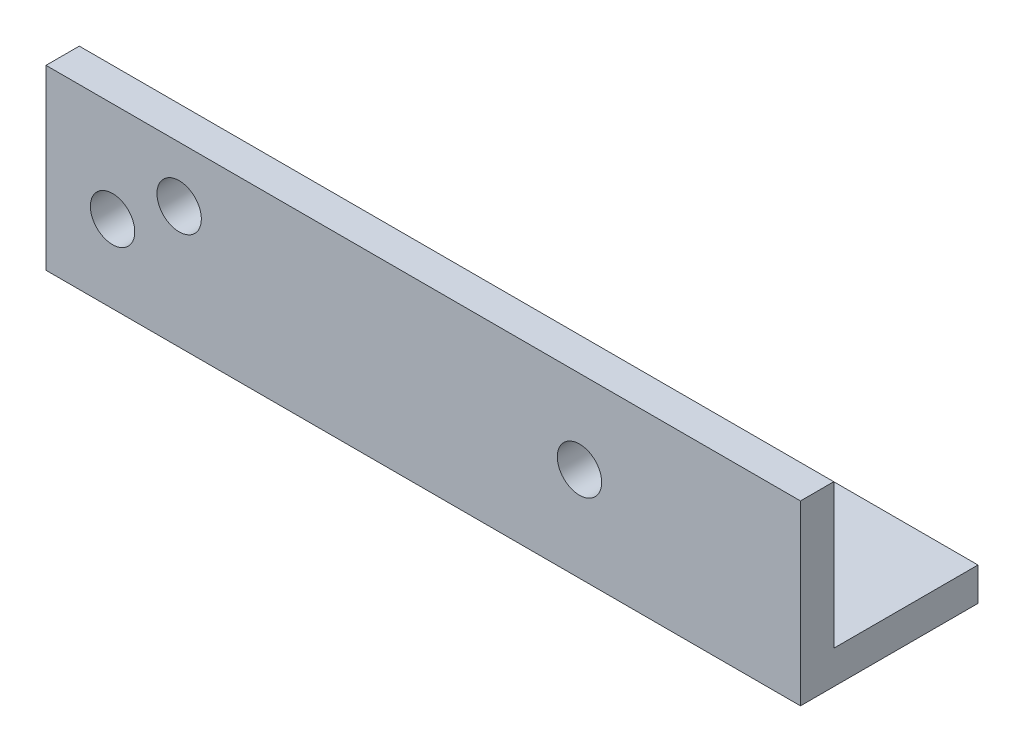
ISO-10303-21;
HEADER;
FILE_DESCRIPTION(('STEP AP214'),'2;1');
FILE_NAME('part.step','',(''),(''),'','','');
FILE_SCHEMA(('AUTOMOTIVE_DESIGN { 1 0 10303 214 1 1 1 1 }'));
ENDSEC;
DATA;
#1=APPLICATION_CONTEXT('core data for automotive mechanical design processes');
#2=APPLICATION_PROTOCOL_DEFINITION('international standard','automotive_design',2000,#1);
#3=PRODUCT_CONTEXT('',#1,'mechanical');
#4=PRODUCT('Part','Part','',(#3));
#5=PRODUCT_RELATED_PRODUCT_CATEGORY('part','',(#4));
#6=PRODUCT_DEFINITION_FORMATION('','',#4);
#7=PRODUCT_DEFINITION_CONTEXT('part definition',#1,'design');
#8=PRODUCT_DEFINITION('design','',#6,#7);
#9=PRODUCT_DEFINITION_SHAPE('','',#8);
#10=(LENGTH_UNIT() NAMED_UNIT(*) SI_UNIT(.MILLI.,.METRE.));
#11=(NAMED_UNIT(*) PLANE_ANGLE_UNIT() SI_UNIT($,.RADIAN.));
#12=(NAMED_UNIT(*) SI_UNIT($,.STERADIAN.) SOLID_ANGLE_UNIT());
#13=UNCERTAINTY_MEASURE_WITH_UNIT(LENGTH_MEASURE(1.E-05),#10,'distance_accuracy_value','');
#14=(GEOMETRIC_REPRESENTATION_CONTEXT(3) GLOBAL_UNCERTAINTY_ASSIGNED_CONTEXT((#13)) GLOBAL_UNIT_ASSIGNED_CONTEXT((#10,
#11,#12)) REPRESENTATION_CONTEXT('',''));
#15=CARTESIAN_POINT('',(0.,0.,0.));
#16=DIRECTION('',(0.,0.,1.));
#17=DIRECTION('',(1.,0.,0.));
#18=AXIS2_PLACEMENT_3D('',#15,#16,#17);
#19=CARTESIAN_POINT('',(107.95,0.,-4.7625));
#20=DIRECTION('',(0.,-1.,0.));
#21=DIRECTION('',(0.,0.,-1.));
#22=AXIS2_PLACEMENT_3D('',#19,#20,#21);
#23=PLANE('',#22);
#24=DIRECTION('',(0.,0.,1.));
#25=VECTOR('',#24,1.);
#26=CARTESIAN_POINT('',(0.,0.,-4.7625));
#27=LINE('',#26,#25);
#28=CARTESIAN_POINT('',(0.,0.,-4.7625));
#29=VERTEX_POINT('',#28);
#30=CARTESIAN_POINT('',(0.,0.,0.));
#31=VERTEX_POINT('',#30);
#32=EDGE_CURVE('E116',#29,#31,#27,.T.);
#33=ORIENTED_EDGE('',*,*,#32,.T.);
#34=DIRECTION('',(-1.,0.,0.));
#35=VECTOR('',#34,1.);
#36=CARTESIAN_POINT('',(107.95,0.,0.));
#37=LINE('',#36,#35);
#38=CARTESIAN_POINT('',(107.95,0.,0.));
#39=VERTEX_POINT('',#38);
#40=EDGE_CURVE('E11',#39,#31,#37,.T.);
#41=ORIENTED_EDGE('',*,*,#40,.F.);
#42=DIRECTION('',(0.,0.,1.));
#43=VECTOR('',#42,1.);
#44=CARTESIAN_POINT('',(107.95,0.,-4.7625));
#45=LINE('',#44,#43);
#46=CARTESIAN_POINT('',(107.95,0.,-4.7625));
#47=VERTEX_POINT('',#46);
#48=EDGE_CURVE('E127',#47,#39,#45,.T.);
#49=ORIENTED_EDGE('',*,*,#48,.F.);
#50=DIRECTION('',(-1.,0.,0.));
#51=VECTOR('',#50,1.);
#52=CARTESIAN_POINT('',(107.95,0.,-4.7625));
#53=LINE('',#52,#51);
#54=EDGE_CURVE('E112',#47,#29,#53,.T.);
#55=ORIENTED_EDGE('',*,*,#54,.T.);
#56=EDGE_LOOP('',(#33,#41,#49,#55));
#57=FACE_BOUND('',#56,.T.);
#58=ADVANCED_FACE('F32',(#57),#23,.F.);
#59=CARTESIAN_POINT('',(107.95,0.,0.));
#60=DIRECTION('',(0.,0.,-1.));
#61=DIRECTION('',(0.,1.,0.));
#62=AXIS2_PLACEMENT_3D('',#59,#60,#61);
#63=PLANE('',#62);
#64=CARTESIAN_POINT('',(76.3321770290875,-11.9296158183965,0.));
#65=DIRECTION('',(0.,0.,1.));
#66=DIRECTION('',(1.,0.,0.));
#67=AXIS2_PLACEMENT_3D('',#64,#65,#66);
#68=CIRCLE('',#67,3.17500000000842);
#69=CARTESIAN_POINT('',(79.5071770290959,-11.9296158183965,0.));
#70=VERTEX_POINT('',#69);
#71=EDGE_CURVE('E285',#70,#70,#68,.T.);
#72=ORIENTED_EDGE('',*,*,#71,.F.);
#73=EDGE_LOOP('',(#72));
#74=FACE_BOUND('',#73,.T.);
#75=CARTESIAN_POINT('',(19.05,-7.9375,0.));
#76=DIRECTION('',(0.,0.,-1.));
#77=DIRECTION('',(0.,1.,0.));
#78=AXIS2_PLACEMENT_3D('',#75,#76,#77);
#79=CIRCLE('',#78,3.175);
#80=CARTESIAN_POINT('',(19.05,-4.7625,0.));
#81=VERTEX_POINT('',#80);
#82=EDGE_CURVE('E272',#81,#81,#79,.F.);
#83=ORIENTED_EDGE('',*,*,#82,.F.);
#84=EDGE_LOOP('',(#83));
#85=FACE_BOUND('',#84,.T.);
#86=CARTESIAN_POINT('',(9.525,-14.2875,0.));
#87=DIRECTION('',(0.,0.,-1.));
#88=DIRECTION('',(0.,1.,0.));
#89=AXIS2_PLACEMENT_3D('',#86,#87,#88);
#90=CIRCLE('',#89,3.175);
#91=CARTESIAN_POINT('',(9.525,-11.1125,0.));
#92=VERTEX_POINT('',#91);
#93=EDGE_CURVE('E120',#92,#92,#90,.F.);
#94=ORIENTED_EDGE('',*,*,#93,.F.);
#95=EDGE_LOOP('',(#94));
#96=FACE_BOUND('',#95,.T.);
#97=DIRECTION('',(0.,-1.,0.));
#98=VECTOR('',#97,1.);
#99=CARTESIAN_POINT('',(0.,0.,0.));
#100=LINE('',#99,#98);
#101=CARTESIAN_POINT('',(0.,-25.4,0.));
#102=VERTEX_POINT('',#101);
#103=EDGE_CURVE('E119',#31,#102,#100,.T.);
#104=ORIENTED_EDGE('',*,*,#103,.T.);
#105=DIRECTION('',(-1.,0.,0.));
#106=VECTOR('',#105,1.);
#107=CARTESIAN_POINT('',(107.95,-25.4,0.));
#108=LINE('',#107,#106);
#109=CARTESIAN_POINT('',(107.95,-25.4,0.));
#110=VERTEX_POINT('',#109);
#111=EDGE_CURVE('E40',#110,#102,#108,.T.);
#112=ORIENTED_EDGE('',*,*,#111,.F.);
#113=DIRECTION('',(0.,-1.,0.));
#114=VECTOR('',#113,1.);
#115=CARTESIAN_POINT('',(107.95,0.,0.));
#116=LINE('',#115,#114);
#117=EDGE_CURVE('E85',#39,#110,#116,.T.);
#118=ORIENTED_EDGE('',*,*,#117,.F.);
#119=ORIENTED_EDGE('',*,*,#40,.T.);
#120=EDGE_LOOP('',(#104,#112,#118,#119));
#121=FACE_BOUND('',#120,.T.);
#122=ADVANCED_FACE('F155',(#74,#85,#96,#121),#63,.F.);
#123=CARTESIAN_POINT('',(107.95,-25.4,0.));
#124=DIRECTION('',(0.,1.,0.));
#125=DIRECTION('',(0.,0.,1.));
#126=AXIS2_PLACEMENT_3D('',#123,#124,#125);
#127=PLANE('',#126);
#128=CARTESIAN_POINT('',(95.2499999999927,-25.4,-12.7000000000052));
#129=DIRECTION('',(0.,-1.,0.));
#130=DIRECTION('',(0.,0.,-1.));
#131=AXIS2_PLACEMENT_3D('',#128,#129,#130);
#132=CIRCLE('',#131,3.17500000000001);
#133=CARTESIAN_POINT('',(95.2499999999927,-25.4,-15.8750000000052));
#134=VERTEX_POINT('',#133);
#135=EDGE_CURVE('E297',#134,#134,#132,.T.);
#136=ORIENTED_EDGE('',*,*,#135,.F.);
#137=EDGE_LOOP('',(#136));
#138=FACE_BOUND('',#137,.T.);
#139=CARTESIAN_POINT('',(69.8499999999927,-25.4,-12.7000000000052));
#140=DIRECTION('',(0.,-1.,0.));
#141=DIRECTION('',(0.,0.,-1.));
#142=AXIS2_PLACEMENT_3D('',#139,#140,#141);
#143=CIRCLE('',#142,3.175);
#144=CARTESIAN_POINT('',(69.8499999999927,-25.4,-15.8750000000052));
#145=VERTEX_POINT('',#144);
#146=EDGE_CURVE('E291',#145,#145,#143,.T.);
#147=ORIENTED_EDGE('',*,*,#146,.F.);
#148=EDGE_LOOP('',(#147));
#149=FACE_BOUND('',#148,.T.);
#150=DIRECTION('',(0.,0.,-1.));
#151=VECTOR('',#150,1.);
#152=CARTESIAN_POINT('',(0.,-25.4,0.));
#153=LINE('',#152,#151);
#154=CARTESIAN_POINT('',(0.,-25.4,-25.4));
#155=VERTEX_POINT('',#154);
#156=EDGE_CURVE('E122',#102,#155,#153,.T.);
#157=ORIENTED_EDGE('',*,*,#156,.T.);
#158=DIRECTION('',(-1.,0.,0.));
#159=VECTOR('',#158,1.);
#160=CARTESIAN_POINT('',(107.95,-25.4,-25.4));
#161=LINE('',#160,#159);
#162=CARTESIAN_POINT('',(107.95,-25.4,-25.4));
#163=VERTEX_POINT('',#162);
#164=EDGE_CURVE('E107',#163,#155,#161,.T.);
#165=ORIENTED_EDGE('',*,*,#164,.F.);
#166=DIRECTION('',(0.,0.,-1.));
#167=VECTOR('',#166,1.);
#168=CARTESIAN_POINT('',(107.95,-25.4,0.));
#169=LINE('',#168,#167);
#170=EDGE_CURVE('E98',#110,#163,#169,.T.);
#171=ORIENTED_EDGE('',*,*,#170,.F.);
#172=ORIENTED_EDGE('',*,*,#111,.T.);
#173=EDGE_LOOP('',(#157,#165,#171,#172));
#174=FACE_BOUND('',#173,.T.);
#175=ADVANCED_FACE('F133',(#138,#149,#174),#127,.F.);
#176=CARTESIAN_POINT('',(107.95,-25.4,-25.4));
#177=DIRECTION('',(0.,0.,1.));
#178=DIRECTION('',(1.,0.,0.));
#179=AXIS2_PLACEMENT_3D('',#176,#177,#178);
#180=PLANE('',#179);
#181=DIRECTION('',(0.,1.,0.));
#182=VECTOR('',#181,1.);
#183=CARTESIAN_POINT('',(0.,-25.4,-25.4));
#184=LINE('',#183,#182);
#185=CARTESIAN_POINT('',(0.,-20.6375,-25.4));
#186=VERTEX_POINT('',#185);
#187=EDGE_CURVE('E106',#155,#186,#184,.T.);
#188=ORIENTED_EDGE('',*,*,#187,.T.);
#189=DIRECTION('',(-1.,0.,0.));
#190=VECTOR('',#189,1.);
#191=CARTESIAN_POINT('',(107.95,-20.6375,-25.4));
#192=LINE('',#191,#190);
#193=CARTESIAN_POINT('',(107.95,-20.6375,-25.4));
#194=VERTEX_POINT('',#193);
#195=EDGE_CURVE('E103',#194,#186,#192,.T.);
#196=ORIENTED_EDGE('',*,*,#195,.F.);
#197=DIRECTION('',(0.,1.,0.));
#198=VECTOR('',#197,1.);
#199=CARTESIAN_POINT('',(107.95,-25.4,-25.4));
#200=LINE('',#199,#198);
#201=EDGE_CURVE('E92',#163,#194,#200,.T.);
#202=ORIENTED_EDGE('',*,*,#201,.F.);
#203=ORIENTED_EDGE('',*,*,#164,.T.);
#204=EDGE_LOOP('',(#188,#196,#202,#203));
#205=FACE_BOUND('',#204,.T.);
#206=ADVANCED_FACE('F104',(#205),#180,.F.);
#207=CARTESIAN_POINT('',(107.95,-20.6375,-25.4));
#208=DIRECTION('',(0.,-1.,0.));
#209=DIRECTION('',(0.,0.,-1.));
#210=AXIS2_PLACEMENT_3D('',#207,#208,#209);
#211=PLANE('',#210);
#212=CARTESIAN_POINT('',(95.2499999999927,-20.6375,-12.7000000000052));
#213=DIRECTION('',(0.,-1.,0.));
#214=DIRECTION('',(0.,0.,-1.));
#215=AXIS2_PLACEMENT_3D('',#212,#213,#214);
#216=CIRCLE('',#215,3.17500000000001);
#217=CARTESIAN_POINT('',(95.2499999999927,-20.6375,-15.8750000000052));
#218=VERTEX_POINT('',#217);
#219=EDGE_CURVE('E294',#218,#218,#216,.F.);
#220=ORIENTED_EDGE('',*,*,#219,.F.);
#221=EDGE_LOOP('',(#220));
#222=FACE_BOUND('',#221,.T.);
#223=CARTESIAN_POINT('',(69.8499999999927,-20.6375,-12.7000000000052));
#224=DIRECTION('',(0.,-1.,0.));
#225=DIRECTION('',(0.,0.,-1.));
#226=AXIS2_PLACEMENT_3D('',#223,#224,#225);
#227=CIRCLE('',#226,3.175);
#228=CARTESIAN_POINT('',(69.8499999999927,-20.6375,-15.8750000000052));
#229=VERTEX_POINT('',#228);
#230=EDGE_CURVE('E288',#229,#229,#227,.F.);
#231=ORIENTED_EDGE('',*,*,#230,.F.);
#232=EDGE_LOOP('',(#231));
#233=FACE_BOUND('',#232,.T.);
#234=DIRECTION('',(0.,0.,1.));
#235=VECTOR('',#234,1.);
#236=CARTESIAN_POINT('',(0.,-20.6375,-25.4));
#237=LINE('',#236,#235);
#238=CARTESIAN_POINT('',(0.,-20.6375,-4.7625));
#239=VERTEX_POINT('',#238);
#240=EDGE_CURVE('E71',#186,#239,#237,.T.);
#241=ORIENTED_EDGE('',*,*,#240,.T.);
#242=DIRECTION('',(-1.,0.,0.));
#243=VECTOR('',#242,1.);
#244=CARTESIAN_POINT('',(107.95,-20.6375,-4.7625));
#245=LINE('',#244,#243);
#246=CARTESIAN_POINT('',(107.95,-20.6375,-4.7625));
#247=VERTEX_POINT('',#246);
#248=EDGE_CURVE('E108',#247,#239,#245,.T.);
#249=ORIENTED_EDGE('',*,*,#248,.F.);
#250=DIRECTION('',(0.,0.,1.));
#251=VECTOR('',#250,1.);
#252=CARTESIAN_POINT('',(107.95,-20.6375,-25.4));
#253=LINE('',#252,#251);
#254=EDGE_CURVE('E96',#194,#247,#253,.T.);
#255=ORIENTED_EDGE('',*,*,#254,.F.);
#256=ORIENTED_EDGE('',*,*,#195,.T.);
#257=EDGE_LOOP('',(#241,#249,#255,#256));
#258=FACE_BOUND('',#257,.T.);
#259=ADVANCED_FACE('F110',(#222,#233,#258),#211,.F.);
#260=CARTESIAN_POINT('',(107.95,-20.6375,-4.7625));
#261=DIRECTION('',(0.,0.,1.));
#262=DIRECTION('',(0.,-1.,0.));
#263=AXIS2_PLACEMENT_3D('',#260,#261,#262);
#264=PLANE('',#263);
#265=CARTESIAN_POINT('',(76.3321770290875,-11.9296158183965,-4.7625));
#266=DIRECTION('',(0.,0.,1.));
#267=DIRECTION('',(0.,-1.,0.));
#268=AXIS2_PLACEMENT_3D('',#265,#266,#267);
#269=CIRCLE('',#268,3.17500000000842);
#270=CARTESIAN_POINT('',(76.3321770290875,-15.1046158184049,-4.7625));
#271=VERTEX_POINT('',#270);
#272=EDGE_CURVE('E282',#271,#271,#269,.F.);
#273=ORIENTED_EDGE('',*,*,#272,.F.);
#274=EDGE_LOOP('',(#273));
#275=FACE_BOUND('',#274,.T.);
#276=CARTESIAN_POINT('',(19.05,-7.9375,-4.7625));
#277=DIRECTION('',(0.,0.,-1.));
#278=DIRECTION('',(0.,1.,0.));
#279=AXIS2_PLACEMENT_3D('',#276,#277,#278);
#280=CIRCLE('',#279,3.175);
#281=CARTESIAN_POINT('',(19.05,-4.7625,-4.7625));
#282=VERTEX_POINT('',#281);
#283=EDGE_CURVE('E279',#282,#282,#280,.T.);
#284=ORIENTED_EDGE('',*,*,#283,.F.);
#285=EDGE_LOOP('',(#284));
#286=FACE_BOUND('',#285,.T.);
#287=CARTESIAN_POINT('',(9.525,-14.2875,-4.7625));
#288=DIRECTION('',(0.,0.,-1.));
#289=DIRECTION('',(0.,1.,0.));
#290=AXIS2_PLACEMENT_3D('',#287,#288,#289);
#291=CIRCLE('',#290,3.175);
#292=CARTESIAN_POINT('',(9.525,-11.1125,-4.7625));
#293=VERTEX_POINT('',#292);
#294=EDGE_CURVE('E267',#293,#293,#291,.T.);
#295=ORIENTED_EDGE('',*,*,#294,.F.);
#296=EDGE_LOOP('',(#295));
#297=FACE_BOUND('',#296,.T.);
#298=DIRECTION('',(0.,1.,0.));
#299=VECTOR('',#298,1.);
#300=CARTESIAN_POINT('',(0.,-20.6375,-4.7625));
#301=LINE('',#300,#299);
#302=EDGE_CURVE('E77',#239,#29,#301,.T.);
#303=ORIENTED_EDGE('',*,*,#302,.T.);
#304=ORIENTED_EDGE('',*,*,#54,.F.);
#305=DIRECTION('',(0.,1.,0.));
#306=VECTOR('',#305,1.);
#307=CARTESIAN_POINT('',(107.95,-20.6375,-4.7625));
#308=LINE('',#307,#306);
#309=EDGE_CURVE('E48',#247,#47,#308,.T.);
#310=ORIENTED_EDGE('',*,*,#309,.F.);
#311=ORIENTED_EDGE('',*,*,#248,.T.);
#312=EDGE_LOOP('',(#303,#304,#310,#311));
#313=FACE_BOUND('',#312,.T.);
#314=ADVANCED_FACE('F140',(#275,#286,#297,#313),#264,.F.);
#315=CARTESIAN_POINT('',(107.95,0.,0.));
#316=DIRECTION('',(1.,0.,0.));
#317=DIRECTION('',(0.,0.,-1.));
#318=AXIS2_PLACEMENT_3D('',#315,#316,#317);
#319=PLANE('',#318);
#320=ORIENTED_EDGE('',*,*,#48,.T.);
#321=ORIENTED_EDGE('',*,*,#117,.T.);
#322=ORIENTED_EDGE('',*,*,#170,.T.);
#323=ORIENTED_EDGE('',*,*,#201,.T.);
#324=ORIENTED_EDGE('',*,*,#254,.T.);
#325=ORIENTED_EDGE('',*,*,#309,.T.);
#326=EDGE_LOOP('',(#320,#321,#322,#323,#324,#325));
#327=FACE_BOUND('',#326,.T.);
#328=ADVANCED_FACE('F94',(#327),#319,.T.);
#329=CARTESIAN_POINT('',(0.,0.,0.));
#330=DIRECTION('',(1.,0.,0.));
#331=DIRECTION('',(0.,0.,-1.));
#332=AXIS2_PLACEMENT_3D('',#329,#330,#331);
#333=PLANE('',#332);
#334=ORIENTED_EDGE('',*,*,#32,.F.);
#335=ORIENTED_EDGE('',*,*,#302,.F.);
#336=ORIENTED_EDGE('',*,*,#240,.F.);
#337=ORIENTED_EDGE('',*,*,#187,.F.);
#338=ORIENTED_EDGE('',*,*,#156,.F.);
#339=ORIENTED_EDGE('',*,*,#103,.F.);
#340=EDGE_LOOP('',(#334,#335,#336,#337,#338,#339));
#341=FACE_BOUND('',#340,.T.);
#342=ADVANCED_FACE('F136',(#341),#333,.F.);
#343=CARTESIAN_POINT('',(9.525,-14.2875,0.001000000000001));
#344=DIRECTION('',(0.,0.,-1.));
#345=DIRECTION('',(0.,1.,0.));
#346=AXIS2_PLACEMENT_3D('',#343,#344,#345);
#347=CYLINDRICAL_SURFACE('',#346,3.175);
#348=ORIENTED_EDGE('',*,*,#294,.T.);
#349=EDGE_LOOP('',(#348));
#350=FACE_BOUND('',#349,.T.);
#351=ORIENTED_EDGE('',*,*,#93,.T.);
#352=EDGE_LOOP('',(#351));
#353=FACE_BOUND('',#352,.T.);
#354=ADVANCED_FACE('F217',(#350,#353),#347,.F.);
#355=CARTESIAN_POINT('',(19.05,-7.9375,0.00100000000000013));
#356=DIRECTION('',(0.,0.,-1.));
#357=DIRECTION('',(0.,1.,0.));
#358=AXIS2_PLACEMENT_3D('',#355,#356,#357);
#359=CYLINDRICAL_SURFACE('',#358,3.175);
#360=ORIENTED_EDGE('',*,*,#283,.T.);
#361=EDGE_LOOP('',(#360));
#362=FACE_BOUND('',#361,.T.);
#363=ORIENTED_EDGE('',*,*,#82,.T.);
#364=EDGE_LOOP('',(#363));
#365=FACE_BOUND('',#364,.T.);
#366=ADVANCED_FACE('F213',(#362,#365),#359,.F.);
#367=CARTESIAN_POINT('',(76.3321770290875,-11.9296158183965,-25.401));
#368=DIRECTION('',(0.,0.,1.));
#369=DIRECTION('',(1.,0.,0.));
#370=AXIS2_PLACEMENT_3D('',#367,#368,#369);
#371=CYLINDRICAL_SURFACE('',#370,3.17500000000842);
#372=ORIENTED_EDGE('',*,*,#71,.T.);
#373=EDGE_LOOP('',(#372));
#374=FACE_BOUND('',#373,.T.);
#375=ORIENTED_EDGE('',*,*,#272,.T.);
#376=EDGE_LOOP('',(#375));
#377=FACE_BOUND('',#376,.T.);
#378=ADVANCED_FACE('F193',(#374,#377),#371,.F.);
#379=CARTESIAN_POINT('',(69.8499999999927,0.001000000000001,-12.7000000000052));
#380=DIRECTION('',(0.,-1.,0.));
#381=DIRECTION('',(0.,0.,-1.));
#382=AXIS2_PLACEMENT_3D('',#379,#380,#381);
#383=CYLINDRICAL_SURFACE('',#382,3.175);
#384=CARTESIAN_POINT('',(69.8499999999927,-25.4,-15.8750000000052));
#385=CARTESIAN_POINT('',(69.8499999999927,-25.350390625,-15.8750000000052));
#386=CARTESIAN_POINT('',(69.8499999999927,-25.30078125,-15.8750000000052));
#387=CARTESIAN_POINT('',(69.8499999999927,-25.2015625,-15.8750000000052));
#388=CARTESIAN_POINT('',(69.8499999999927,-25.151953125,-15.8750000000052));
#389=CARTESIAN_POINT('',(69.8499999999927,-25.052734375,-15.8750000000052));
#390=CARTESIAN_POINT('',(69.8499999999927,-25.003125,-15.8750000000052));
#391=CARTESIAN_POINT('',(69.8499999999927,-24.90390625,-15.8750000000052));
#392=CARTESIAN_POINT('',(69.8499999999927,-24.854296875,-15.8750000000052));
#393=CARTESIAN_POINT('',(69.8499999999927,-24.755078125,-15.8750000000052));
#394=CARTESIAN_POINT('',(69.8499999999927,-24.70546875,-15.8750000000052));
#395=CARTESIAN_POINT('',(69.8499999999927,-24.60625,-15.8750000000052));
#396=CARTESIAN_POINT('',(69.8499999999927,-24.556640625,-15.8750000000052));
#397=CARTESIAN_POINT('',(69.8499999999927,-24.457421875,-15.8750000000052));
#398=CARTESIAN_POINT('',(69.8499999999927,-24.4078125,-15.8750000000052));
#399=CARTESIAN_POINT('',(69.8499999999927,-24.30859375,-15.8750000000052));
#400=CARTESIAN_POINT('',(69.8499999999927,-24.258984375,-15.8750000000052));
#401=CARTESIAN_POINT('',(69.8499999999927,-24.159765625,-15.8750000000052));
#402=CARTESIAN_POINT('',(69.8499999999927,-24.11015625,-15.8750000000052));
#403=CARTESIAN_POINT('',(69.8499999999927,-24.0109375,-15.8750000000052));
#404=CARTESIAN_POINT('',(69.8499999999927,-23.961328125,-15.8750000000052));
#405=CARTESIAN_POINT('',(69.8499999999927,-23.862109375,-15.8750000000052));
#406=CARTESIAN_POINT('',(69.8499999999927,-23.8125,-15.8750000000052));
#407=CARTESIAN_POINT('',(69.8499999999927,-23.71328125,-15.8750000000052));
#408=CARTESIAN_POINT('',(69.8499999999927,-23.663671875,-15.8750000000052));
#409=CARTESIAN_POINT('',(69.8499999999927,-23.564453125,-15.8750000000052));
#410=CARTESIAN_POINT('',(69.8499999999927,-23.51484375,-15.8750000000052));
#411=CARTESIAN_POINT('',(69.8499999999927,-23.415625,-15.8750000000052));
#412=CARTESIAN_POINT('',(69.8499999999927,-23.366015625,-15.8750000000052));
#413=CARTESIAN_POINT('',(69.8499999999927,-23.266796875,-15.8750000000052));
#414=CARTESIAN_POINT('',(69.8499999999927,-23.2171875,-15.8750000000052));
#415=CARTESIAN_POINT('',(69.8499999999927,-23.11796875,-15.8750000000052));
#416=CARTESIAN_POINT('',(69.8499999999927,-23.068359375,-15.8750000000052));
#417=CARTESIAN_POINT('',(69.8499999999927,-22.969140625,-15.8750000000052));
#418=CARTESIAN_POINT('',(69.8499999999927,-22.91953125,-15.8750000000052));
#419=CARTESIAN_POINT('',(69.8499999999927,-22.8203125,-15.8750000000052));
#420=CARTESIAN_POINT('',(69.8499999999927,-22.770703125,-15.8750000000052));
#421=CARTESIAN_POINT('',(69.8499999999927,-22.671484375,-15.8750000000052));
#422=CARTESIAN_POINT('',(69.8499999999927,-22.621875,-15.8750000000052));
#423=CARTESIAN_POINT('',(69.8499999999927,-22.52265625,-15.8750000000052));
#424=CARTESIAN_POINT('',(69.8499999999927,-22.473046875,-15.8750000000052));
#425=CARTESIAN_POINT('',(69.8499999999927,-22.373828125,-15.8750000000052));
#426=CARTESIAN_POINT('',(69.8499999999927,-22.32421875,-15.8750000000052));
#427=CARTESIAN_POINT('',(69.8499999999927,-22.225,-15.8750000000052));
#428=CARTESIAN_POINT('',(69.8499999999927,-22.175390625,-15.8750000000052));
#429=CARTESIAN_POINT('',(69.8499999999927,-22.076171875,-15.8750000000052));
#430=CARTESIAN_POINT('',(69.8499999999927,-22.0265625,-15.8750000000052));
#431=CARTESIAN_POINT('',(69.8499999999927,-21.92734375,-15.8750000000052));
#432=CARTESIAN_POINT('',(69.8499999999927,-21.877734375,-15.8750000000052));
#433=CARTESIAN_POINT('',(69.8499999999927,-21.778515625,-15.8750000000052));
#434=CARTESIAN_POINT('',(69.8499999999927,-21.72890625,-15.8750000000052));
#435=CARTESIAN_POINT('',(69.8499999999927,-21.6296875,-15.8750000000052));
#436=CARTESIAN_POINT('',(69.8499999999927,-21.580078125,-15.8750000000052));
#437=CARTESIAN_POINT('',(69.8499999999927,-21.480859375,-15.8750000000052));
#438=CARTESIAN_POINT('',(69.8499999999927,-21.43125,-15.8750000000052));
#439=CARTESIAN_POINT('',(69.8499999999927,-21.33203125,-15.8750000000052));
#440=CARTESIAN_POINT('',(69.8499999999927,-21.282421875,-15.8750000000052));
#441=CARTESIAN_POINT('',(69.8499999999927,-21.183203125,-15.8750000000052));
#442=CARTESIAN_POINT('',(69.8499999999927,-21.13359375,-15.8750000000052));
#443=CARTESIAN_POINT('',(69.8499999999927,-21.034375,-15.8750000000052));
#444=CARTESIAN_POINT('',(69.8499999999927,-20.984765625,-15.8750000000052));
#445=CARTESIAN_POINT('',(69.8499999999927,-20.885546875,-15.8750000000052));
#446=CARTESIAN_POINT('',(69.8499999999927,-20.8359375,-15.8750000000052));
#447=CARTESIAN_POINT('',(69.8499999999927,-20.73671875,-15.8750000000052));
#448=CARTESIAN_POINT('',(69.8499999999927,-20.687109375,-15.8750000000052));
#449=CARTESIAN_POINT('',(69.8499999999927,-20.6375,-15.8750000000052));
#450=B_SPLINE_CURVE_WITH_KNOTS('',3,(#384,#385,#386,#387,#388,#389,#390,#391,#392,#393,#394,
#395,#396,#397,#398,#399,#400,#401,#402,#403,#404,#405,#406,#407,#408,#409,#410,#411,#412,#413,
#414,#415,#416,#417,#418,#419,#420,#421,#422,#423,#424,#425,#426,#427,#428,#429,#430,#431,#432,
#433,#434,#435,#436,#437,#438,#439,#440,#441,#442,#443,#444,#445,#446,#447,#448,#449),
.UNSPECIFIED.,.F.,.F.,(4,2,2,2,2,2,2,2,2,2,2,2,2,2,2,2,2,2,2,2,2,2,2,2,2,2,2,2,2,2,2,2,4),(0.,
0.148828125,0.29765625,0.446484375,0.5953125,0.744140625,0.892968750000001,1.041796875,1.190625,
1.339453125,1.48828125,1.637109375,1.7859375,1.934765625,2.08359375,2.232421875,2.38125,
2.530078125,2.67890625,2.827734375,2.9765625,3.125390625,3.27421875,3.42304687499999,3.571875,
3.720703125,3.86953125,4.018359375,4.1671875,4.316015625,4.46484375,4.613671875,4.7625),.UNSPECIFIED.);
#451=EDGE_CURVE('BSEAM187',#145,#229,#450,.T.);
#452=ORIENTED_EDGE('',*,*,#146,.T.);
#453=ORIENTED_EDGE('',*,*,#230,.T.);
#454=ORIENTED_EDGE('',*,*,#451,.T.);
#455=ORIENTED_EDGE('',*,*,#451,.F.);
#456=EDGE_LOOP('',(#452,#454,#453,#455));
#457=FACE_BOUND('',#456,.T.);
#458=ADVANCED_FACE('F187',(#457),#383,.F.);
#459=CARTESIAN_POINT('',(95.2499999999927,0.001000000000001,-12.7000000000052));
#460=DIRECTION('',(0.,-1.,0.));
#461=DIRECTION('',(0.,0.,-1.));
#462=AXIS2_PLACEMENT_3D('',#459,#460,#461);
#463=CYLINDRICAL_SURFACE('',#462,3.17500000000001);
#464=CARTESIAN_POINT('',(95.2499999999927,-25.4,-15.8750000000052));
#465=CARTESIAN_POINT('',(95.2499999999927,-25.350390625,-15.8750000000052));
#466=CARTESIAN_POINT('',(95.2499999999927,-25.30078125,-15.8750000000052));
#467=CARTESIAN_POINT('',(95.2499999999927,-25.2015625,-15.8750000000052));
#468=CARTESIAN_POINT('',(95.2499999999927,-25.151953125,-15.8750000000052));
#469=CARTESIAN_POINT('',(95.2499999999927,-25.052734375,-15.8750000000052));
#470=CARTESIAN_POINT('',(95.2499999999927,-25.003125,-15.8750000000052));
#471=CARTESIAN_POINT('',(95.2499999999927,-24.90390625,-15.8750000000052));
#472=CARTESIAN_POINT('',(95.2499999999927,-24.854296875,-15.8750000000052));
#473=CARTESIAN_POINT('',(95.2499999999927,-24.755078125,-15.8750000000052));
#474=CARTESIAN_POINT('',(95.2499999999927,-24.70546875,-15.8750000000052));
#475=CARTESIAN_POINT('',(95.2499999999927,-24.60625,-15.8750000000052));
#476=CARTESIAN_POINT('',(95.2499999999927,-24.556640625,-15.8750000000052));
#477=CARTESIAN_POINT('',(95.2499999999927,-24.457421875,-15.8750000000052));
#478=CARTESIAN_POINT('',(95.2499999999927,-24.4078125,-15.8750000000052));
#479=CARTESIAN_POINT('',(95.2499999999927,-24.30859375,-15.8750000000052));
#480=CARTESIAN_POINT('',(95.2499999999927,-24.258984375,-15.8750000000052));
#481=CARTESIAN_POINT('',(95.2499999999927,-24.159765625,-15.8750000000052));
#482=CARTESIAN_POINT('',(95.2499999999927,-24.11015625,-15.8750000000052));
#483=CARTESIAN_POINT('',(95.2499999999927,-24.0109375,-15.8750000000052));
#484=CARTESIAN_POINT('',(95.2499999999927,-23.961328125,-15.8750000000052));
#485=CARTESIAN_POINT('',(95.2499999999927,-23.862109375,-15.8750000000052));
#486=CARTESIAN_POINT('',(95.2499999999927,-23.8125,-15.8750000000052));
#487=CARTESIAN_POINT('',(95.2499999999927,-23.71328125,-15.8750000000052));
#488=CARTESIAN_POINT('',(95.2499999999927,-23.663671875,-15.8750000000052));
#489=CARTESIAN_POINT('',(95.2499999999927,-23.564453125,-15.8750000000052));
#490=CARTESIAN_POINT('',(95.2499999999927,-23.51484375,-15.8750000000052));
#491=CARTESIAN_POINT('',(95.2499999999927,-23.415625,-15.8750000000052));
#492=CARTESIAN_POINT('',(95.2499999999927,-23.366015625,-15.8750000000052));
#493=CARTESIAN_POINT('',(95.2499999999927,-23.266796875,-15.8750000000052));
#494=CARTESIAN_POINT('',(95.2499999999927,-23.2171875,-15.8750000000052));
#495=CARTESIAN_POINT('',(95.2499999999927,-23.11796875,-15.8750000000052));
#496=CARTESIAN_POINT('',(95.2499999999927,-23.068359375,-15.8750000000052));
#497=CARTESIAN_POINT('',(95.2499999999927,-22.969140625,-15.8750000000052));
#498=CARTESIAN_POINT('',(95.2499999999927,-22.91953125,-15.8750000000052));
#499=CARTESIAN_POINT('',(95.2499999999927,-22.8203125,-15.8750000000052));
#500=CARTESIAN_POINT('',(95.2499999999927,-22.770703125,-15.8750000000052));
#501=CARTESIAN_POINT('',(95.2499999999927,-22.671484375,-15.8750000000052));
#502=CARTESIAN_POINT('',(95.2499999999927,-22.621875,-15.8750000000052));
#503=CARTESIAN_POINT('',(95.2499999999927,-22.52265625,-15.8750000000052));
#504=CARTESIAN_POINT('',(95.2499999999927,-22.473046875,-15.8750000000052));
#505=CARTESIAN_POINT('',(95.2499999999927,-22.373828125,-15.8750000000052));
#506=CARTESIAN_POINT('',(95.2499999999927,-22.32421875,-15.8750000000052));
#507=CARTESIAN_POINT('',(95.2499999999927,-22.225,-15.8750000000052));
#508=CARTESIAN_POINT('',(95.2499999999927,-22.175390625,-15.8750000000052));
#509=CARTESIAN_POINT('',(95.2499999999927,-22.076171875,-15.8750000000052));
#510=CARTESIAN_POINT('',(95.2499999999927,-22.0265625,-15.8750000000052));
#511=CARTESIAN_POINT('',(95.2499999999927,-21.92734375,-15.8750000000052));
#512=CARTESIAN_POINT('',(95.2499999999927,-21.877734375,-15.8750000000052));
#513=CARTESIAN_POINT('',(95.2499999999927,-21.778515625,-15.8750000000052));
#514=CARTESIAN_POINT('',(95.2499999999927,-21.72890625,-15.8750000000052));
#515=CARTESIAN_POINT('',(95.2499999999927,-21.6296875,-15.8750000000052));
#516=CARTESIAN_POINT('',(95.2499999999927,-21.580078125,-15.8750000000052));
#517=CARTESIAN_POINT('',(95.2499999999927,-21.480859375,-15.8750000000052));
#518=CARTESIAN_POINT('',(95.2499999999927,-21.43125,-15.8750000000052));
#519=CARTESIAN_POINT('',(95.2499999999927,-21.33203125,-15.8750000000052));
#520=CARTESIAN_POINT('',(95.2499999999927,-21.282421875,-15.8750000000052));
#521=CARTESIAN_POINT('',(95.2499999999927,-21.183203125,-15.8750000000052));
#522=CARTESIAN_POINT('',(95.2499999999927,-21.13359375,-15.8750000000052));
#523=CARTESIAN_POINT('',(95.2499999999927,-21.034375,-15.8750000000052));
#524=CARTESIAN_POINT('',(95.2499999999927,-20.984765625,-15.8750000000052));
#525=CARTESIAN_POINT('',(95.2499999999927,-20.885546875,-15.8750000000052));
#526=CARTESIAN_POINT('',(95.2499999999927,-20.8359375,-15.8750000000052));
#527=CARTESIAN_POINT('',(95.2499999999927,-20.73671875,-15.8750000000052));
#528=CARTESIAN_POINT('',(95.2499999999927,-20.687109375,-15.8750000000052));
#529=CARTESIAN_POINT('',(95.2499999999927,-20.6375,-15.8750000000052));
#530=B_SPLINE_CURVE_WITH_KNOTS('',3,(#464,#465,#466,#467,#468,#469,#470,#471,#472,#473,#474,
#475,#476,#477,#478,#479,#480,#481,#482,#483,#484,#485,#486,#487,#488,#489,#490,#491,#492,#493,
#494,#495,#496,#497,#498,#499,#500,#501,#502,#503,#504,#505,#506,#507,#508,#509,#510,#511,#512,
#513,#514,#515,#516,#517,#518,#519,#520,#521,#522,#523,#524,#525,#526,#527,#528,#529),
.UNSPECIFIED.,.F.,.F.,(4,2,2,2,2,2,2,2,2,2,2,2,2,2,2,2,2,2,2,2,2,2,2,2,2,2,2,2,2,2,2,2,4),(0.,
0.148828125,0.29765625,0.446484375,0.5953125,0.744140625,0.892968750000001,1.041796875,1.190625,
1.339453125,1.48828125,1.637109375,1.7859375,1.934765625,2.08359375,2.232421875,2.38125,
2.530078125,2.67890625,2.827734375,2.9765625,3.125390625,3.27421875,3.42304687499999,3.571875,
3.720703125,3.86953125,4.018359375,4.1671875,4.316015625,4.46484375,4.613671875,4.7625),.UNSPECIFIED.);
#531=EDGE_CURVE('BSEAM192',#134,#218,#530,.T.);
#532=ORIENTED_EDGE('',*,*,#135,.T.);
#533=ORIENTED_EDGE('',*,*,#219,.T.);
#534=ORIENTED_EDGE('',*,*,#531,.T.);
#535=ORIENTED_EDGE('',*,*,#531,.F.);
#536=EDGE_LOOP('',(#532,#534,#533,#535));
#537=FACE_BOUND('',#536,.T.);
#538=ADVANCED_FACE('F192',(#537),#463,.F.);
#539=CLOSED_SHELL('',(#58,#122,#175,#206,#259,#314,#328,#342,#354,#366,#378,#458,#538));
#540=MANIFOLD_SOLID_BREP('B2',#539);
#541=ADVANCED_BREP_SHAPE_REPRESENTATION('',(#18,#540),#14);
#542=SHAPE_DEFINITION_REPRESENTATION(#9,#541);
ENDSEC;
END-ISO-10303-21;
